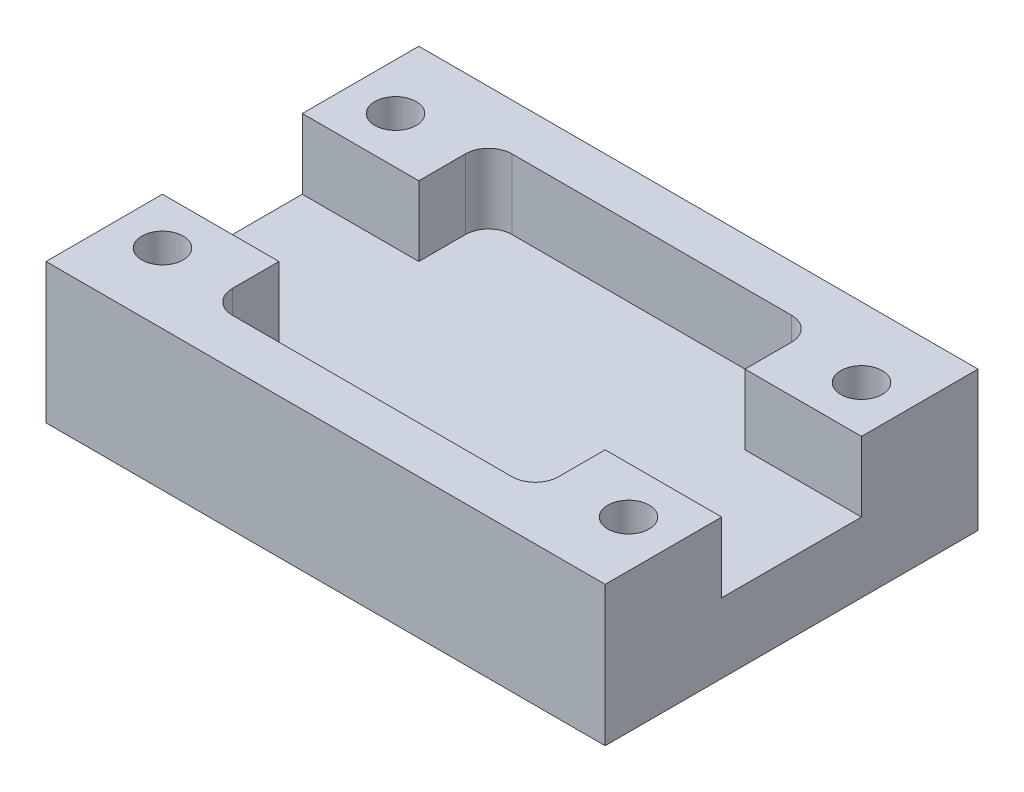
ISO-10303-21;
HEADER;
FILE_DESCRIPTION(('STEP AP214'),'2;1');
FILE_NAME('part.step','',(''),(''),'','','');
FILE_SCHEMA(('AUTOMOTIVE_DESIGN { 1 0 10303 214 1 1 1 1 }'));
ENDSEC;
DATA;
#1=APPLICATION_CONTEXT('core data for automotive mechanical design processes');
#2=APPLICATION_PROTOCOL_DEFINITION('international standard','automotive_design',2000,#1);
#3=PRODUCT_CONTEXT('',#1,'mechanical');
#4=PRODUCT('Part','Part','',(#3));
#5=PRODUCT_RELATED_PRODUCT_CATEGORY('part','',(#4));
#6=PRODUCT_DEFINITION_FORMATION('','',#4);
#7=PRODUCT_DEFINITION_CONTEXT('part definition',#1,'design');
#8=PRODUCT_DEFINITION('design','',#6,#7);
#9=PRODUCT_DEFINITION_SHAPE('','',#8);
#10=(LENGTH_UNIT() NAMED_UNIT(*) SI_UNIT(.MILLI.,.METRE.));
#11=(NAMED_UNIT(*) PLANE_ANGLE_UNIT() SI_UNIT($,.RADIAN.));
#12=(NAMED_UNIT(*) SI_UNIT($,.STERADIAN.) SOLID_ANGLE_UNIT());
#13=UNCERTAINTY_MEASURE_WITH_UNIT(LENGTH_MEASURE(1.E-05),#10,'distance_accuracy_value','');
#14=(GEOMETRIC_REPRESENTATION_CONTEXT(3) GLOBAL_UNCERTAINTY_ASSIGNED_CONTEXT((#13)) GLOBAL_UNIT_ASSIGNED_CONTEXT((#10,
#11,#12)) REPRESENTATION_CONTEXT('',''));
#15=CARTESIAN_POINT('',(0.,0.,0.));
#16=DIRECTION('',(0.,0.,1.));
#17=DIRECTION('',(1.,0.,0.));
#18=AXIS2_PLACEMENT_3D('',#15,#16,#17);
#19=CARTESIAN_POINT('',(-12.,6.,8.));
#20=DIRECTION('',(1.,0.,0.));
#21=DIRECTION('',(0.,0.,-1.));
#22=AXIS2_PLACEMENT_3D('',#19,#20,#21);
#23=PLANE('',#22);
#24=DIRECTION('',(0.,1.,0.));
#25=VECTOR('',#24,1.);
#26=CARTESIAN_POINT('',(-12.,3.,-3.));
#27=LINE('',#26,#25);
#28=CARTESIAN_POINT('',(-12.,3.,-3.));
#29=VERTEX_POINT('',#28);
#30=CARTESIAN_POINT('',(-12.,6.,-3.));
#31=VERTEX_POINT('',#30);
#32=EDGE_CURVE('E178',#29,#31,#27,.T.);
#33=ORIENTED_EDGE('',*,*,#32,.T.);
#34=DIRECTION('',(0.,0.,1.));
#35=VECTOR('',#34,1.);
#36=CARTESIAN_POINT('',(-12.,6.,8.));
#37=LINE('',#36,#35);
#38=CARTESIAN_POINT('',(-12.,6.,-8.));
#39=VERTEX_POINT('',#38);
#40=EDGE_CURVE('E303',#39,#31,#37,.T.);
#41=ORIENTED_EDGE('',*,*,#40,.F.);
#42=DIRECTION('',(0.,-1.,0.));
#43=VECTOR('',#42,1.);
#44=CARTESIAN_POINT('',(-12.,6.,-8.));
#45=LINE('',#44,#43);
#46=CARTESIAN_POINT('',(-12.,0.,-8.));
#47=VERTEX_POINT('',#46);
#48=EDGE_CURVE('E329',#39,#47,#45,.T.);
#49=ORIENTED_EDGE('',*,*,#48,.T.);
#50=DIRECTION('',(0.,0.,1.));
#51=VECTOR('',#50,1.);
#52=CARTESIAN_POINT('',(-12.,0.,8.));
#53=LINE('',#52,#51);
#54=CARTESIAN_POINT('',(-12.,0.,8.));
#55=VERTEX_POINT('',#54);
#56=EDGE_CURVE('E316',#47,#55,#53,.T.);
#57=ORIENTED_EDGE('',*,*,#56,.T.);
#58=DIRECTION('',(0.,-1.,0.));
#59=VECTOR('',#58,1.);
#60=CARTESIAN_POINT('',(-12.,6.,8.));
#61=LINE('',#60,#59);
#62=CARTESIAN_POINT('',(-12.,6.,8.));
#63=VERTEX_POINT('',#62);
#64=EDGE_CURVE('E325',#63,#55,#61,.T.);
#65=ORIENTED_EDGE('',*,*,#64,.F.);
#66=CARTESIAN_POINT('',(-12.,6.,3.));
#67=VERTEX_POINT('',#66);
#68=EDGE_CURVE('E302',#67,#63,#37,.T.);
#69=ORIENTED_EDGE('',*,*,#68,.F.);
#70=DIRECTION('',(0.,1.,0.));
#71=VECTOR('',#70,1.);
#72=CARTESIAN_POINT('',(-12.,3.,3.));
#73=LINE('',#72,#71);
#74=CARTESIAN_POINT('',(-12.,3.,3.));
#75=VERTEX_POINT('',#74);
#76=EDGE_CURVE('E191',#75,#67,#73,.T.);
#77=ORIENTED_EDGE('',*,*,#76,.F.);
#78=DIRECTION('',(0.,0.,1.));
#79=VECTOR('',#78,1.);
#80=CARTESIAN_POINT('',(-12.,3.,0.));
#81=LINE('',#80,#79);
#82=EDGE_CURVE('E199',#29,#75,#81,.T.);
#83=ORIENTED_EDGE('',*,*,#82,.F.);
#84=EDGE_LOOP('',(#33,#41,#49,#57,#65,#69,#77,#83));
#85=FACE_BOUND('',#84,.T.);
#86=ADVANCED_FACE('F42',(#85),#23,.F.);
#87=CARTESIAN_POINT('',(0.,6.,0.));
#88=DIRECTION('',(0.,-1.,0.));
#89=DIRECTION('',(0.,0.,-1.));
#90=AXIS2_PLACEMENT_3D('',#87,#88,#89);
#91=PLANE('',#90);
#92=CARTESIAN_POINT('',(10.,6.,-5.));
#93=DIRECTION('',(0.,1.,0.));
#94=DIRECTION('',(0.,0.,1.));
#95=AXIS2_PLACEMENT_3D('',#92,#93,#94);
#96=CIRCLE('',#95,0.889);
#97=CARTESIAN_POINT('',(10.,6.,-4.111));
#98=VERTEX_POINT('',#97);
#99=EDGE_CURVE('E427',#98,#98,#96,.T.);
#100=ORIENTED_EDGE('',*,*,#99,.F.);
#101=EDGE_LOOP('',(#100));
#102=FACE_BOUND('',#101,.T.);
#103=CARTESIAN_POINT('',(-10.,6.,-5.));
#104=DIRECTION('',(0.,1.,0.));
#105=DIRECTION('',(0.,0.,1.));
#106=AXIS2_PLACEMENT_3D('',#103,#104,#105);
#107=CIRCLE('',#106,0.889);
#108=CARTESIAN_POINT('',(-10.,6.,-4.111));
#109=VERTEX_POINT('',#108);
#110=EDGE_CURVE('E408',#109,#109,#107,.T.);
#111=ORIENTED_EDGE('',*,*,#110,.F.);
#112=EDGE_LOOP('',(#111));
#113=FACE_BOUND('',#112,.T.);
#114=DIRECTION('',(1.,0.,0.));
#115=VECTOR('',#114,1.);
#116=CARTESIAN_POINT('',(0.,6.,-3.));
#117=LINE('',#116,#115);
#118=CARTESIAN_POINT('',(-7.,6.,-3.));
#119=VERTEX_POINT('',#118);
#120=EDGE_CURVE('E185',#31,#119,#117,.T.);
#121=ORIENTED_EDGE('',*,*,#120,.T.);
#122=DIRECTION('',(0.,0.,-1.));
#123=VECTOR('',#122,1.);
#124=CARTESIAN_POINT('',(-7.,6.,0.));
#125=LINE('',#124,#123);
#126=CARTESIAN_POINT('',(-7.,6.,-5.));
#127=VERTEX_POINT('',#126);
#128=EDGE_CURVE('E203',#119,#127,#125,.T.);
#129=ORIENTED_EDGE('',*,*,#128,.T.);
#130=CARTESIAN_POINT('',(-6.,6.,-5.));
#131=DIRECTION('',(0.,-1.,0.));
#132=DIRECTION('',(0.,0.,-1.));
#133=AXIS2_PLACEMENT_3D('',#130,#131,#132);
#134=CIRCLE('',#133,1.);
#135=CARTESIAN_POINT('',(-6.,6.,-6.));
#136=VERTEX_POINT('',#135);
#137=EDGE_CURVE('E11',#127,#136,#134,.T.);
#138=ORIENTED_EDGE('',*,*,#137,.T.);
#139=DIRECTION('',(1.,0.,0.));
#140=VECTOR('',#139,1.);
#141=CARTESIAN_POINT('',(0.,6.,-6.));
#142=LINE('',#141,#140);
#143=CARTESIAN_POINT('',(6.,6.,-6.));
#144=VERTEX_POINT('',#143);
#145=EDGE_CURVE('E266',#136,#144,#142,.T.);
#146=ORIENTED_EDGE('',*,*,#145,.T.);
#147=CARTESIAN_POINT('',(6.,6.,-5.));
#148=DIRECTION('',(0.,-1.,0.));
#149=DIRECTION('',(0.,0.,-1.));
#150=AXIS2_PLACEMENT_3D('',#147,#148,#149);
#151=CIRCLE('',#150,1.);
#152=CARTESIAN_POINT('',(7.,6.,-5.));
#153=VERTEX_POINT('',#152);
#154=EDGE_CURVE('E376',#144,#153,#151,.T.);
#155=ORIENTED_EDGE('',*,*,#154,.T.);
#156=DIRECTION('',(0.,0.,-1.));
#157=VECTOR('',#156,1.);
#158=CARTESIAN_POINT('',(7.,6.,0.));
#159=LINE('',#158,#157);
#160=CARTESIAN_POINT('',(7.,6.,-3.));
#161=VERTEX_POINT('',#160);
#162=EDGE_CURVE('E258',#161,#153,#159,.T.);
#163=ORIENTED_EDGE('',*,*,#162,.F.);
#164=DIRECTION('',(-1.,0.,0.));
#165=VECTOR('',#164,1.);
#166=CARTESIAN_POINT('',(0.,6.,-3.));
#167=LINE('',#166,#165);
#168=CARTESIAN_POINT('',(12.,6.,-3.));
#169=VERTEX_POINT('',#168);
#170=EDGE_CURVE('E262',#169,#161,#167,.T.);
#171=ORIENTED_EDGE('',*,*,#170,.F.);
#172=DIRECTION('',(0.,0.,-1.));
#173=VECTOR('',#172,1.);
#174=CARTESIAN_POINT('',(12.,6.,8.));
#175=LINE('',#174,#173);
#176=CARTESIAN_POINT('',(12.,6.,-8.));
#177=VERTEX_POINT('',#176);
#178=EDGE_CURVE('E299',#169,#177,#175,.T.);
#179=ORIENTED_EDGE('',*,*,#178,.T.);
#180=DIRECTION('',(-1.,0.,0.));
#181=VECTOR('',#180,1.);
#182=CARTESIAN_POINT('',(-12.,6.,-8.));
#183=LINE('',#182,#181);
#184=EDGE_CURVE('E298',#177,#39,#183,.T.);
#185=ORIENTED_EDGE('',*,*,#184,.T.);
#186=ORIENTED_EDGE('',*,*,#40,.T.);
#187=EDGE_LOOP('',(#121,#129,#138,#146,#155,#163,#171,#179,#185,#186));
#188=FACE_BOUND('',#187,.T.);
#189=ADVANCED_FACE('F398',(#102,#113,#188),#91,.F.);
#190=CARTESIAN_POINT('',(10.,6.,5.));
#191=DIRECTION('',(0.,1.,0.));
#192=DIRECTION('',(0.,0.,1.));
#193=AXIS2_PLACEMENT_3D('',#190,#191,#192);
#194=CIRCLE('',#193,0.889);
#195=CARTESIAN_POINT('',(10.,6.,5.889));
#196=VERTEX_POINT('',#195);
#197=EDGE_CURVE('E419',#196,#196,#194,.T.);
#198=ORIENTED_EDGE('',*,*,#197,.F.);
#199=EDGE_LOOP('',(#198));
#200=FACE_BOUND('',#199,.T.);
#201=CARTESIAN_POINT('',(-10.,6.,5.));
#202=DIRECTION('',(0.,1.,0.));
#203=DIRECTION('',(0.,0.,1.));
#204=AXIS2_PLACEMENT_3D('',#201,#202,#203);
#205=CIRCLE('',#204,0.889);
#206=CARTESIAN_POINT('',(-10.,6.,5.889));
#207=VERTEX_POINT('',#206);
#208=EDGE_CURVE('E412',#207,#207,#205,.T.);
#209=ORIENTED_EDGE('',*,*,#208,.F.);
#210=EDGE_LOOP('',(#209));
#211=FACE_BOUND('',#210,.T.);
#212=DIRECTION('',(-1.,0.,0.));
#213=VECTOR('',#212,1.);
#214=CARTESIAN_POINT('',(0.,6.,3.));
#215=LINE('',#214,#213);
#216=CARTESIAN_POINT('',(12.,6.,3.));
#217=VERTEX_POINT('',#216);
#218=CARTESIAN_POINT('',(7.,6.,3.));
#219=VERTEX_POINT('',#218);
#220=EDGE_CURVE('E257',#217,#219,#215,.T.);
#221=ORIENTED_EDGE('',*,*,#220,.T.);
#222=CARTESIAN_POINT('',(7.,6.,5.));
#223=VERTEX_POINT('',#222);
#224=EDGE_CURVE('E254',#223,#219,#159,.T.);
#225=ORIENTED_EDGE('',*,*,#224,.F.);
#226=CARTESIAN_POINT('',(6.,6.,5.));
#227=DIRECTION('',(0.,-1.,0.));
#228=DIRECTION('',(0.,0.,-1.));
#229=AXIS2_PLACEMENT_3D('',#226,#227,#228);
#230=CIRCLE('',#229,1.);
#231=CARTESIAN_POINT('',(6.,6.,6.));
#232=VERTEX_POINT('',#231);
#233=EDGE_CURVE('E379',#223,#232,#230,.T.);
#234=ORIENTED_EDGE('',*,*,#233,.T.);
#235=DIRECTION('',(1.,0.,0.));
#236=VECTOR('',#235,1.);
#237=CARTESIAN_POINT('',(0.,6.,6.));
#238=LINE('',#237,#236);
#239=CARTESIAN_POINT('',(-6.,6.,6.));
#240=VERTEX_POINT('',#239);
#241=EDGE_CURVE('E250',#240,#232,#238,.T.);
#242=ORIENTED_EDGE('',*,*,#241,.F.);
#243=CARTESIAN_POINT('',(-6.,6.,5.));
#244=DIRECTION('',(0.,-1.,0.));
#245=DIRECTION('',(0.,0.,-1.));
#246=AXIS2_PLACEMENT_3D('',#243,#244,#245);
#247=CIRCLE('',#246,1.);
#248=CARTESIAN_POINT('',(-7.,6.,5.));
#249=VERTEX_POINT('',#248);
#250=EDGE_CURVE('E51',#240,#249,#247,.T.);
#251=ORIENTED_EDGE('',*,*,#250,.T.);
#252=CARTESIAN_POINT('',(-7.,6.,3.));
#253=VERTEX_POINT('',#252);
#254=EDGE_CURVE('E247',#249,#253,#125,.T.);
#255=ORIENTED_EDGE('',*,*,#254,.T.);
#256=DIRECTION('',(1.,0.,0.));
#257=VECTOR('',#256,1.);
#258=CARTESIAN_POINT('',(0.,6.,3.));
#259=LINE('',#258,#257);
#260=EDGE_CURVE('E242',#67,#253,#259,.T.);
#261=ORIENTED_EDGE('',*,*,#260,.F.);
#262=ORIENTED_EDGE('',*,*,#68,.T.);
#263=DIRECTION('',(1.,0.,0.));
#264=VECTOR('',#263,1.);
#265=CARTESIAN_POINT('',(-12.,6.,8.));
#266=LINE('',#265,#264);
#267=CARTESIAN_POINT('',(12.,6.,8.));
#268=VERTEX_POINT('',#267);
#269=EDGE_CURVE('E306',#63,#268,#266,.T.);
#270=ORIENTED_EDGE('',*,*,#269,.T.);
#271=EDGE_CURVE('E294',#268,#217,#175,.T.);
#272=ORIENTED_EDGE('',*,*,#271,.T.);
#273=EDGE_LOOP('',(#221,#225,#234,#242,#251,#255,#261,#262,#270,#272));
#274=FACE_BOUND('',#273,.T.);
#275=ADVANCED_FACE('F449',(#200,#211,#274),#91,.F.);
#276=CARTESIAN_POINT('',(12.,6.,8.));
#277=DIRECTION('',(-1.,0.,0.));
#278=DIRECTION('',(0.,0.,1.));
#279=AXIS2_PLACEMENT_3D('',#276,#277,#278);
#280=PLANE('',#279);
#281=ORIENTED_EDGE('',*,*,#178,.F.);
#282=DIRECTION('',(0.,1.,0.));
#283=VECTOR('',#282,1.);
#284=CARTESIAN_POINT('',(12.,3.,-3.));
#285=LINE('',#284,#283);
#286=CARTESIAN_POINT('',(12.,3.,-3.));
#287=VERTEX_POINT('',#286);
#288=EDGE_CURVE('E277',#287,#169,#285,.T.);
#289=ORIENTED_EDGE('',*,*,#288,.F.);
#290=DIRECTION('',(0.,0.,-1.));
#291=VECTOR('',#290,1.);
#292=CARTESIAN_POINT('',(12.,3.,0.));
#293=LINE('',#292,#291);
#294=CARTESIAN_POINT('',(12.,3.,3.));
#295=VERTEX_POINT('',#294);
#296=EDGE_CURVE('E228',#295,#287,#293,.T.);
#297=ORIENTED_EDGE('',*,*,#296,.F.);
#298=DIRECTION('',(0.,1.,0.));
#299=VECTOR('',#298,1.);
#300=CARTESIAN_POINT('',(12.,3.,3.));
#301=LINE('',#300,#299);
#302=EDGE_CURVE('E280',#295,#217,#301,.T.);
#303=ORIENTED_EDGE('',*,*,#302,.T.);
#304=ORIENTED_EDGE('',*,*,#271,.F.);
#305=DIRECTION('',(0.,-1.,0.));
#306=VECTOR('',#305,1.);
#307=CARTESIAN_POINT('',(12.,6.,8.));
#308=LINE('',#307,#306);
#309=CARTESIAN_POINT('',(12.,0.,8.));
#310=VERTEX_POINT('',#309);
#311=EDGE_CURVE('E309',#268,#310,#308,.T.);
#312=ORIENTED_EDGE('',*,*,#311,.T.);
#313=DIRECTION('',(0.,0.,-1.));
#314=VECTOR('',#313,1.);
#315=CARTESIAN_POINT('',(12.,0.,8.));
#316=LINE('',#315,#314);
#317=CARTESIAN_POINT('',(12.,0.,-8.));
#318=VERTEX_POINT('',#317);
#319=EDGE_CURVE('E273',#310,#318,#316,.T.);
#320=ORIENTED_EDGE('',*,*,#319,.T.);
#321=DIRECTION('',(0.,-1.,0.));
#322=VECTOR('',#321,1.);
#323=CARTESIAN_POINT('',(12.,6.,-8.));
#324=LINE('',#323,#322);
#325=EDGE_CURVE('E333',#177,#318,#324,.T.);
#326=ORIENTED_EDGE('',*,*,#325,.F.);
#327=EDGE_LOOP('',(#281,#289,#297,#303,#304,#312,#320,#326));
#328=FACE_BOUND('',#327,.T.);
#329=ADVANCED_FACE('F478',(#328),#280,.F.);
#330=CARTESIAN_POINT('',(-12.,6.,-8.));
#331=DIRECTION('',(0.,0.,1.));
#332=DIRECTION('',(1.,0.,0.));
#333=AXIS2_PLACEMENT_3D('',#330,#331,#332);
#334=PLANE('',#333);
#335=DIRECTION('',(-1.,0.,0.));
#336=VECTOR('',#335,1.);
#337=CARTESIAN_POINT('',(-12.,0.,-8.));
#338=LINE('',#337,#336);
#339=EDGE_CURVE('E313',#318,#47,#338,.T.);
#340=ORIENTED_EDGE('',*,*,#339,.T.);
#341=ORIENTED_EDGE('',*,*,#48,.F.);
#342=ORIENTED_EDGE('',*,*,#184,.F.);
#343=ORIENTED_EDGE('',*,*,#325,.T.);
#344=EDGE_LOOP('',(#340,#341,#342,#343));
#345=FACE_BOUND('',#344,.T.);
#346=ADVANCED_FACE('F475',(#345),#334,.F.);
#347=CARTESIAN_POINT('',(-12.,6.,8.));
#348=DIRECTION('',(0.,0.,-1.));
#349=DIRECTION('',(-1.,0.,0.));
#350=AXIS2_PLACEMENT_3D('',#347,#348,#349);
#351=PLANE('',#350);
#352=DIRECTION('',(1.,0.,0.));
#353=VECTOR('',#352,1.);
#354=CARTESIAN_POINT('',(-12.,0.,8.));
#355=LINE('',#354,#353);
#356=EDGE_CURVE('E319',#55,#310,#355,.T.);
#357=ORIENTED_EDGE('',*,*,#356,.T.);
#358=ORIENTED_EDGE('',*,*,#311,.F.);
#359=ORIENTED_EDGE('',*,*,#269,.F.);
#360=ORIENTED_EDGE('',*,*,#64,.T.);
#361=EDGE_LOOP('',(#357,#358,#359,#360));
#362=FACE_BOUND('',#361,.T.);
#363=ADVANCED_FACE('F473',(#362),#351,.F.);
#364=CARTESIAN_POINT('',(0.,0.,0.));
#365=DIRECTION('',(0.,-1.,0.));
#366=DIRECTION('',(0.,0.,-1.));
#367=AXIS2_PLACEMENT_3D('',#364,#365,#366);
#368=PLANE('',#367);
#369=CARTESIAN_POINT('',(10.,0.,-5.));
#370=DIRECTION('',(0.,1.,0.));
#371=DIRECTION('',(0.,0.,1.));
#372=AXIS2_PLACEMENT_3D('',#369,#370,#371);
#373=CIRCLE('',#372,0.889);
#374=CARTESIAN_POINT('',(10.,0.,-4.111));
#375=VERTEX_POINT('',#374);
#376=EDGE_CURVE('E431',#375,#375,#373,.T.);
#377=ORIENTED_EDGE('',*,*,#376,.T.);
#378=EDGE_LOOP('',(#377));
#379=FACE_BOUND('',#378,.T.);
#380=CARTESIAN_POINT('',(10.,0.,5.));
#381=DIRECTION('',(0.,1.,0.));
#382=DIRECTION('',(0.,0.,1.));
#383=AXIS2_PLACEMENT_3D('',#380,#381,#382);
#384=CIRCLE('',#383,0.889);
#385=CARTESIAN_POINT('',(10.,0.,5.889));
#386=VERTEX_POINT('',#385);
#387=EDGE_CURVE('E423',#386,#386,#384,.T.);
#388=ORIENTED_EDGE('',*,*,#387,.T.);
#389=EDGE_LOOP('',(#388));
#390=FACE_BOUND('',#389,.T.);
#391=CARTESIAN_POINT('',(-10.,0.,5.));
#392=DIRECTION('',(0.,1.,0.));
#393=DIRECTION('',(0.,0.,1.));
#394=AXIS2_PLACEMENT_3D('',#391,#392,#393);
#395=CIRCLE('',#394,0.889);
#396=CARTESIAN_POINT('',(-10.,0.,5.889));
#397=VERTEX_POINT('',#396);
#398=EDGE_CURVE('E415',#397,#397,#395,.T.);
#399=ORIENTED_EDGE('',*,*,#398,.T.);
#400=EDGE_LOOP('',(#399));
#401=FACE_BOUND('',#400,.T.);
#402=CARTESIAN_POINT('',(-10.,0.,-5.));
#403=DIRECTION('',(0.,1.,0.));
#404=DIRECTION('',(0.,0.,1.));
#405=AXIS2_PLACEMENT_3D('',#402,#403,#404);
#406=CIRCLE('',#405,0.889);
#407=CARTESIAN_POINT('',(-10.,0.,-4.111));
#408=VERTEX_POINT('',#407);
#409=EDGE_CURVE('E243',#408,#408,#406,.T.);
#410=ORIENTED_EDGE('',*,*,#409,.T.);
#411=EDGE_LOOP('',(#410));
#412=FACE_BOUND('',#411,.T.);
#413=ORIENTED_EDGE('',*,*,#319,.F.);
#414=ORIENTED_EDGE('',*,*,#356,.F.);
#415=ORIENTED_EDGE('',*,*,#56,.F.);
#416=ORIENTED_EDGE('',*,*,#339,.F.);
#417=EDGE_LOOP('',(#413,#414,#415,#416));
#418=FACE_BOUND('',#417,.T.);
#419=ADVANCED_FACE('F437',(#379,#390,#401,#412,#418),#368,.T.);
#420=CARTESIAN_POINT('',(0.,3.,-3.));
#421=DIRECTION('',(0.,0.,1.));
#422=DIRECTION('',(1.,0.,0.));
#423=AXIS2_PLACEMENT_3D('',#420,#421,#422);
#424=PLANE('',#423);
#425=ORIENTED_EDGE('',*,*,#120,.F.);
#426=ORIENTED_EDGE('',*,*,#32,.F.);
#427=DIRECTION('',(1.,0.,0.));
#428=VECTOR('',#427,1.);
#429=CARTESIAN_POINT('',(0.,3.,-3.));
#430=LINE('',#429,#428);
#431=CARTESIAN_POINT('',(-7.,3.,-3.));
#432=VERTEX_POINT('',#431);
#433=EDGE_CURVE('E182',#29,#432,#430,.T.);
#434=ORIENTED_EDGE('',*,*,#433,.T.);
#435=DIRECTION('',(0.,1.,0.));
#436=VECTOR('',#435,1.);
#437=CARTESIAN_POINT('',(-7.,3.,-3.));
#438=LINE('',#437,#436);
#439=EDGE_CURVE('E270',#432,#119,#438,.T.);
#440=ORIENTED_EDGE('',*,*,#439,.T.);
#441=EDGE_LOOP('',(#425,#426,#434,#440));
#442=FACE_BOUND('',#441,.T.);
#443=ADVANCED_FACE('F180',(#442),#424,.T.);
#444=CARTESIAN_POINT('',(-7.,3.,0.));
#445=DIRECTION('',(1.,0.,0.));
#446=DIRECTION('',(0.,0.,-1.));
#447=AXIS2_PLACEMENT_3D('',#444,#445,#446);
#448=PLANE('',#447);
#449=DIRECTION('',(0.,0.,-1.));
#450=VECTOR('',#449,1.);
#451=CARTESIAN_POINT('',(-7.,3.,0.));
#452=LINE('',#451,#450);
#453=CARTESIAN_POINT('',(-7.,3.,-5.));
#454=VERTEX_POINT('',#453);
#455=EDGE_CURVE('E192',#432,#454,#452,.T.);
#456=ORIENTED_EDGE('',*,*,#455,.T.);
#457=DIRECTION('',(0.,1.,0.));
#458=VECTOR('',#457,1.);
#459=CARTESIAN_POINT('',(-7.,6.,-5.));
#460=LINE('',#459,#458);
#461=EDGE_CURVE('E373',#454,#127,#460,.T.);
#462=ORIENTED_EDGE('',*,*,#461,.T.);
#463=ORIENTED_EDGE('',*,*,#128,.F.);
#464=ORIENTED_EDGE('',*,*,#439,.F.);
#465=EDGE_LOOP('',(#456,#462,#463,#464));
#466=FACE_BOUND('',#465,.T.);
#467=ADVANCED_FACE('F530',(#466),#448,.T.);
#468=CARTESIAN_POINT('',(0.,3.,-6.));
#469=DIRECTION('',(0.,0.,1.));
#470=DIRECTION('',(1.,0.,0.));
#471=AXIS2_PLACEMENT_3D('',#468,#469,#470);
#472=PLANE('',#471);
#473=DIRECTION('',(1.,0.,0.));
#474=VECTOR('',#473,1.);
#475=CARTESIAN_POINT('',(0.,3.,-6.));
#476=LINE('',#475,#474);
#477=CARTESIAN_POINT('',(-6.,3.,-6.));
#478=VERTEX_POINT('',#477);
#479=CARTESIAN_POINT('',(6.,3.,-6.));
#480=VERTEX_POINT('',#479);
#481=EDGE_CURVE('E236',#478,#480,#476,.T.);
#482=ORIENTED_EDGE('',*,*,#481,.T.);
#483=DIRECTION('',(0.,1.,0.));
#484=VECTOR('',#483,1.);
#485=CARTESIAN_POINT('',(6.,3.,-6.));
#486=LINE('',#485,#484);
#487=EDGE_CURVE('E340',#480,#144,#486,.T.);
#488=ORIENTED_EDGE('',*,*,#487,.T.);
#489=ORIENTED_EDGE('',*,*,#145,.F.);
#490=DIRECTION('',(0.,1.,0.));
#491=VECTOR('',#490,1.);
#492=CARTESIAN_POINT('',(-6.,3.,-6.));
#493=LINE('',#492,#491);
#494=EDGE_CURVE('E337',#136,#478,#493,.F.);
#495=ORIENTED_EDGE('',*,*,#494,.T.);
#496=EDGE_LOOP('',(#482,#488,#489,#495));
#497=FACE_BOUND('',#496,.T.);
#498=ADVANCED_FACE('F396',(#497),#472,.T.);
#499=CARTESIAN_POINT('',(7.,3.,0.));
#500=DIRECTION('',(1.,0.,0.));
#501=DIRECTION('',(0.,0.,-1.));
#502=AXIS2_PLACEMENT_3D('',#499,#500,#501);
#503=PLANE('',#502);
#504=ORIENTED_EDGE('',*,*,#162,.T.);
#505=DIRECTION('',(0.,1.,0.));
#506=VECTOR('',#505,1.);
#507=CARTESIAN_POINT('',(7.,3.,-5.));
#508=LINE('',#507,#506);
#509=CARTESIAN_POINT('',(7.,3.,-5.));
#510=VERTEX_POINT('',#509);
#511=EDGE_CURVE('E344',#153,#510,#508,.F.);
#512=ORIENTED_EDGE('',*,*,#511,.T.);
#513=DIRECTION('',(0.,0.,-1.));
#514=VECTOR('',#513,1.);
#515=CARTESIAN_POINT('',(7.,3.,0.));
#516=LINE('',#515,#514);
#517=CARTESIAN_POINT('',(7.,3.,-3.));
#518=VERTEX_POINT('',#517);
#519=EDGE_CURVE('E224',#518,#510,#516,.T.);
#520=ORIENTED_EDGE('',*,*,#519,.F.);
#521=DIRECTION('',(0.,1.,0.));
#522=VECTOR('',#521,1.);
#523=CARTESIAN_POINT('',(7.,3.,-3.));
#524=LINE('',#523,#522);
#525=EDGE_CURVE('E274',#518,#161,#524,.T.);
#526=ORIENTED_EDGE('',*,*,#525,.T.);
#527=EDGE_LOOP('',(#504,#512,#520,#526));
#528=FACE_BOUND('',#527,.T.);
#529=ADVANCED_FACE('F522',(#528),#503,.F.);
#530=CARTESIAN_POINT('',(0.,3.,-3.));
#531=DIRECTION('',(0.,0.,-1.));
#532=DIRECTION('',(-1.,0.,0.));
#533=AXIS2_PLACEMENT_3D('',#530,#531,#532);
#534=PLANE('',#533);
#535=ORIENTED_EDGE('',*,*,#170,.T.);
#536=ORIENTED_EDGE('',*,*,#525,.F.);
#537=DIRECTION('',(-1.,0.,0.));
#538=VECTOR('',#537,1.);
#539=CARTESIAN_POINT('',(0.,3.,-3.));
#540=LINE('',#539,#538);
#541=EDGE_CURVE('E232',#287,#518,#540,.T.);
#542=ORIENTED_EDGE('',*,*,#541,.F.);
#543=ORIENTED_EDGE('',*,*,#288,.T.);
#544=EDGE_LOOP('',(#535,#536,#542,#543));
#545=FACE_BOUND('',#544,.T.);
#546=ADVANCED_FACE('F520',(#545),#534,.F.);
#547=CARTESIAN_POINT('',(0.,3.,3.));
#548=DIRECTION('',(0.,0.,-1.));
#549=DIRECTION('',(-1.,0.,0.));
#550=AXIS2_PLACEMENT_3D('',#547,#548,#549);
#551=PLANE('',#550);
#552=ORIENTED_EDGE('',*,*,#220,.F.);
#553=ORIENTED_EDGE('',*,*,#302,.F.);
#554=DIRECTION('',(-1.,0.,0.));
#555=VECTOR('',#554,1.);
#556=CARTESIAN_POINT('',(0.,3.,3.));
#557=LINE('',#556,#555);
#558=CARTESIAN_POINT('',(7.,3.,3.));
#559=VERTEX_POINT('',#558);
#560=EDGE_CURVE('E223',#295,#559,#557,.T.);
#561=ORIENTED_EDGE('',*,*,#560,.T.);
#562=DIRECTION('',(0.,1.,0.));
#563=VECTOR('',#562,1.);
#564=CARTESIAN_POINT('',(7.,3.,3.));
#565=LINE('',#564,#563);
#566=EDGE_CURVE('E284',#559,#219,#565,.T.);
#567=ORIENTED_EDGE('',*,*,#566,.T.);
#568=EDGE_LOOP('',(#552,#553,#561,#567));
#569=FACE_BOUND('',#568,.T.);
#570=ADVANCED_FACE('F509',(#569),#551,.T.);
#571=CARTESIAN_POINT('',(7.,3.,5.));
#572=VERTEX_POINT('',#571);
#573=EDGE_CURVE('E220',#572,#559,#516,.T.);
#574=ORIENTED_EDGE('',*,*,#573,.F.);
#575=DIRECTION('',(0.,1.,0.));
#576=VECTOR('',#575,1.);
#577=CARTESIAN_POINT('',(7.,6.,5.));
#578=LINE('',#577,#576);
#579=EDGE_CURVE('E359',#572,#223,#578,.T.);
#580=ORIENTED_EDGE('',*,*,#579,.T.);
#581=ORIENTED_EDGE('',*,*,#224,.T.);
#582=ORIENTED_EDGE('',*,*,#566,.F.);
#583=EDGE_LOOP('',(#574,#580,#581,#582));
#584=FACE_BOUND('',#583,.T.);
#585=ADVANCED_FACE('F506',(#584),#503,.F.);
#586=CARTESIAN_POINT('',(0.,3.,6.));
#587=DIRECTION('',(0.,0.,1.));
#588=DIRECTION('',(1.,0.,0.));
#589=AXIS2_PLACEMENT_3D('',#586,#587,#588);
#590=PLANE('',#589);
#591=ORIENTED_EDGE('',*,*,#241,.T.);
#592=DIRECTION('',(0.,1.,0.));
#593=VECTOR('',#592,1.);
#594=CARTESIAN_POINT('',(6.,3.,6.));
#595=LINE('',#594,#593);
#596=CARTESIAN_POINT('',(6.,3.,6.));
#597=VERTEX_POINT('',#596);
#598=EDGE_CURVE('E367',#232,#597,#595,.F.);
#599=ORIENTED_EDGE('',*,*,#598,.T.);
#600=DIRECTION('',(1.,0.,0.));
#601=VECTOR('',#600,1.);
#602=CARTESIAN_POINT('',(0.,3.,6.));
#603=LINE('',#602,#601);
#604=CARTESIAN_POINT('',(-6.,3.,6.));
#605=VERTEX_POINT('',#604);
#606=EDGE_CURVE('E216',#605,#597,#603,.T.);
#607=ORIENTED_EDGE('',*,*,#606,.F.);
#608=DIRECTION('',(0.,1.,0.));
#609=VECTOR('',#608,1.);
#610=CARTESIAN_POINT('',(-6.,3.,6.));
#611=LINE('',#610,#609);
#612=EDGE_CURVE('E363',#605,#240,#611,.T.);
#613=ORIENTED_EDGE('',*,*,#612,.T.);
#614=EDGE_LOOP('',(#591,#599,#607,#613));
#615=FACE_BOUND('',#614,.T.);
#616=ADVANCED_FACE('F499',(#615),#590,.F.);
#617=ORIENTED_EDGE('',*,*,#254,.F.);
#618=DIRECTION('',(0.,1.,0.));
#619=VECTOR('',#618,1.);
#620=CARTESIAN_POINT('',(-7.,3.,5.));
#621=LINE('',#620,#619);
#622=CARTESIAN_POINT('',(-7.,3.,5.));
#623=VERTEX_POINT('',#622);
#624=EDGE_CURVE('E370',#249,#623,#621,.F.);
#625=ORIENTED_EDGE('',*,*,#624,.T.);
#626=CARTESIAN_POINT('',(-7.,3.,3.));
#627=VERTEX_POINT('',#626);
#628=EDGE_CURVE('E210',#623,#627,#452,.T.);
#629=ORIENTED_EDGE('',*,*,#628,.T.);
#630=DIRECTION('',(0.,1.,0.));
#631=VECTOR('',#630,1.);
#632=CARTESIAN_POINT('',(-7.,3.,3.));
#633=LINE('',#632,#631);
#634=EDGE_CURVE('E288',#627,#253,#633,.T.);
#635=ORIENTED_EDGE('',*,*,#634,.T.);
#636=EDGE_LOOP('',(#617,#625,#629,#635));
#637=FACE_BOUND('',#636,.T.);
#638=ADVANCED_FACE('F537',(#637),#448,.T.);
#639=CARTESIAN_POINT('',(0.,3.,3.));
#640=DIRECTION('',(0.,0.,1.));
#641=DIRECTION('',(1.,0.,0.));
#642=AXIS2_PLACEMENT_3D('',#639,#640,#641);
#643=PLANE('',#642);
#644=ORIENTED_EDGE('',*,*,#260,.T.);
#645=ORIENTED_EDGE('',*,*,#634,.F.);
#646=DIRECTION('',(1.,0.,0.));
#647=VECTOR('',#646,1.);
#648=CARTESIAN_POINT('',(0.,3.,3.));
#649=LINE('',#648,#647);
#650=EDGE_CURVE('E207',#75,#627,#649,.T.);
#651=ORIENTED_EDGE('',*,*,#650,.F.);
#652=ORIENTED_EDGE('',*,*,#76,.T.);
#653=EDGE_LOOP('',(#644,#645,#651,#652));
#654=FACE_BOUND('',#653,.T.);
#655=ADVANCED_FACE('F543',(#654),#643,.F.);
#656=CARTESIAN_POINT('',(0.,3.,0.));
#657=DIRECTION('',(0.,1.,0.));
#658=DIRECTION('',(0.,0.,1.));
#659=AXIS2_PLACEMENT_3D('',#656,#657,#658);
#660=PLANE('',#659);
#661=ORIENTED_EDGE('',*,*,#519,.T.);
#662=CARTESIAN_POINT('',(6.,3.,-5.));
#663=DIRECTION('',(0.,1.,0.));
#664=DIRECTION('',(0.,0.,1.));
#665=AXIS2_PLACEMENT_3D('',#662,#663,#664);
#666=CIRCLE('',#665,1.);
#667=EDGE_CURVE('E356',#510,#480,#666,.T.);
#668=ORIENTED_EDGE('',*,*,#667,.T.);
#669=ORIENTED_EDGE('',*,*,#481,.F.);
#670=CARTESIAN_POINT('',(-6.,3.,-5.));
#671=DIRECTION('',(0.,1.,0.));
#672=DIRECTION('',(0.,0.,1.));
#673=AXIS2_PLACEMENT_3D('',#670,#671,#672);
#674=CIRCLE('',#673,1.);
#675=EDGE_CURVE('E347',#478,#454,#674,.T.);
#676=ORIENTED_EDGE('',*,*,#675,.T.);
#677=ORIENTED_EDGE('',*,*,#455,.F.);
#678=ORIENTED_EDGE('',*,*,#433,.F.);
#679=ORIENTED_EDGE('',*,*,#82,.T.);
#680=ORIENTED_EDGE('',*,*,#650,.T.);
#681=ORIENTED_EDGE('',*,*,#628,.F.);
#682=CARTESIAN_POINT('',(-6.,3.,5.));
#683=DIRECTION('',(0.,1.,0.));
#684=DIRECTION('',(0.,0.,1.));
#685=AXIS2_PLACEMENT_3D('',#682,#683,#684);
#686=CIRCLE('',#685,1.);
#687=EDGE_CURVE('E350',#623,#605,#686,.T.);
#688=ORIENTED_EDGE('',*,*,#687,.T.);
#689=ORIENTED_EDGE('',*,*,#606,.T.);
#690=CARTESIAN_POINT('',(6.,3.,5.));
#691=DIRECTION('',(0.,1.,0.));
#692=DIRECTION('',(0.,0.,1.));
#693=AXIS2_PLACEMENT_3D('',#690,#691,#692);
#694=CIRCLE('',#693,1.);
#695=EDGE_CURVE('E353',#597,#572,#694,.T.);
#696=ORIENTED_EDGE('',*,*,#695,.T.);
#697=ORIENTED_EDGE('',*,*,#573,.T.);
#698=ORIENTED_EDGE('',*,*,#560,.F.);
#699=ORIENTED_EDGE('',*,*,#296,.T.);
#700=ORIENTED_EDGE('',*,*,#541,.T.);
#701=EDGE_LOOP('',(#661,#668,#669,#676,#677,#678,#679,#680,#681,#688,#689,#696,#697,#698,#699,#700));
#702=FACE_BOUND('',#701,.T.);
#703=ADVANCED_FACE('F197',(#702),#660,.T.);
#704=CARTESIAN_POINT('',(6.,3.,-5.));
#705=DIRECTION('',(0.,1.,0.));
#706=DIRECTION('',(0.,0.,1.));
#707=AXIS2_PLACEMENT_3D('',#704,#705,#706);
#708=CYLINDRICAL_SURFACE('',#707,1.);
#709=ORIENTED_EDGE('',*,*,#667,.F.);
#710=ORIENTED_EDGE('',*,*,#511,.F.);
#711=ORIENTED_EDGE('',*,*,#154,.F.);
#712=ORIENTED_EDGE('',*,*,#487,.F.);
#713=EDGE_LOOP('',(#709,#710,#711,#712));
#714=FACE_BOUND('',#713,.T.);
#715=ADVANCED_FACE('F393',(#714),#708,.F.);
#716=CARTESIAN_POINT('',(6.,3.,5.));
#717=DIRECTION('',(0.,-1.,0.));
#718=DIRECTION('',(0.,0.,-1.));
#719=AXIS2_PLACEMENT_3D('',#716,#717,#718);
#720=CYLINDRICAL_SURFACE('',#719,1.);
#721=ORIENTED_EDGE('',*,*,#695,.F.);
#722=ORIENTED_EDGE('',*,*,#598,.F.);
#723=ORIENTED_EDGE('',*,*,#233,.F.);
#724=ORIENTED_EDGE('',*,*,#579,.F.);
#725=EDGE_LOOP('',(#721,#722,#723,#724));
#726=FACE_BOUND('',#725,.T.);
#727=ADVANCED_FACE('F485',(#726),#720,.F.);
#728=CARTESIAN_POINT('',(-6.,3.,5.));
#729=DIRECTION('',(0.,1.,0.));
#730=DIRECTION('',(0.,0.,1.));
#731=AXIS2_PLACEMENT_3D('',#728,#729,#730);
#732=CYLINDRICAL_SURFACE('',#731,1.);
#733=ORIENTED_EDGE('',*,*,#687,.F.);
#734=ORIENTED_EDGE('',*,*,#624,.F.);
#735=ORIENTED_EDGE('',*,*,#250,.F.);
#736=ORIENTED_EDGE('',*,*,#612,.F.);
#737=EDGE_LOOP('',(#733,#734,#735,#736));
#738=FACE_BOUND('',#737,.T.);
#739=ADVANCED_FACE('F464',(#738),#732,.F.);
#740=CARTESIAN_POINT('',(-6.,3.,-5.));
#741=DIRECTION('',(0.,-1.,0.));
#742=DIRECTION('',(0.,0.,-1.));
#743=AXIS2_PLACEMENT_3D('',#740,#741,#742);
#744=CYLINDRICAL_SURFACE('',#743,1.);
#745=ORIENTED_EDGE('',*,*,#675,.F.);
#746=ORIENTED_EDGE('',*,*,#494,.F.);
#747=ORIENTED_EDGE('',*,*,#137,.F.);
#748=ORIENTED_EDGE('',*,*,#461,.F.);
#749=EDGE_LOOP('',(#745,#746,#747,#748));
#750=FACE_BOUND('',#749,.T.);
#751=ADVANCED_FACE('F44',(#750),#744,.F.);
#752=CARTESIAN_POINT('',(-10.,0.,-5.));
#753=DIRECTION('',(0.,1.,0.));
#754=DIRECTION('',(0.,0.,1.));
#755=AXIS2_PLACEMENT_3D('',#752,#753,#754);
#756=CYLINDRICAL_SURFACE('',#755,0.889);
#757=ORIENTED_EDGE('',*,*,#409,.F.);
#758=EDGE_LOOP('',(#757));
#759=FACE_BOUND('',#758,.T.);
#760=ORIENTED_EDGE('',*,*,#110,.T.);
#761=EDGE_LOOP('',(#760));
#762=FACE_BOUND('',#761,.T.);
#763=ADVANCED_FACE('F453',(#759,#762),#756,.F.);
#764=CARTESIAN_POINT('',(-10.,0.,5.));
#765=DIRECTION('',(0.,1.,0.));
#766=DIRECTION('',(0.,0.,1.));
#767=AXIS2_PLACEMENT_3D('',#764,#765,#766);
#768=CYLINDRICAL_SURFACE('',#767,0.889);
#769=ORIENTED_EDGE('',*,*,#398,.F.);
#770=EDGE_LOOP('',(#769));
#771=FACE_BOUND('',#770,.T.);
#772=ORIENTED_EDGE('',*,*,#208,.T.);
#773=EDGE_LOOP('',(#772));
#774=FACE_BOUND('',#773,.T.);
#775=ADVANCED_FACE('F455',(#771,#774),#768,.F.);
#776=CARTESIAN_POINT('',(10.,0.,5.));
#777=DIRECTION('',(0.,1.,0.));
#778=DIRECTION('',(0.,0.,1.));
#779=AXIS2_PLACEMENT_3D('',#776,#777,#778);
#780=CYLINDRICAL_SURFACE('',#779,0.889);
#781=ORIENTED_EDGE('',*,*,#387,.F.);
#782=EDGE_LOOP('',(#781));
#783=FACE_BOUND('',#782,.T.);
#784=ORIENTED_EDGE('',*,*,#197,.T.);
#785=EDGE_LOOP('',(#784));
#786=FACE_BOUND('',#785,.T.);
#787=ADVANCED_FACE('F443',(#783,#786),#780,.F.);
#788=CARTESIAN_POINT('',(10.,0.,-5.));
#789=DIRECTION('',(0.,1.,0.));
#790=DIRECTION('',(0.,0.,1.));
#791=AXIS2_PLACEMENT_3D('',#788,#789,#790);
#792=CYLINDRICAL_SURFACE('',#791,0.889);
#793=ORIENTED_EDGE('',*,*,#376,.F.);
#794=EDGE_LOOP('',(#793));
#795=FACE_BOUND('',#794,.T.);
#796=ORIENTED_EDGE('',*,*,#99,.T.);
#797=EDGE_LOOP('',(#796));
#798=FACE_BOUND('',#797,.T.);
#799=ADVANCED_FACE('F440',(#795,#798),#792,.F.);
#800=CLOSED_SHELL('',(#86,#189,#275,#329,#346,#363,#419,#443,#467,#498,#529,#546,#570,#585,#616,
#638,#655,#703,#715,#727,#739,#751,#763,#775,#787,#799));
#801=MANIFOLD_SOLID_BREP('B2',#800);
#802=ADVANCED_BREP_SHAPE_REPRESENTATION('',(#18,#801),#14);
#803=SHAPE_DEFINITION_REPRESENTATION(#9,#802);
ENDSEC;
END-ISO-10303-21;
